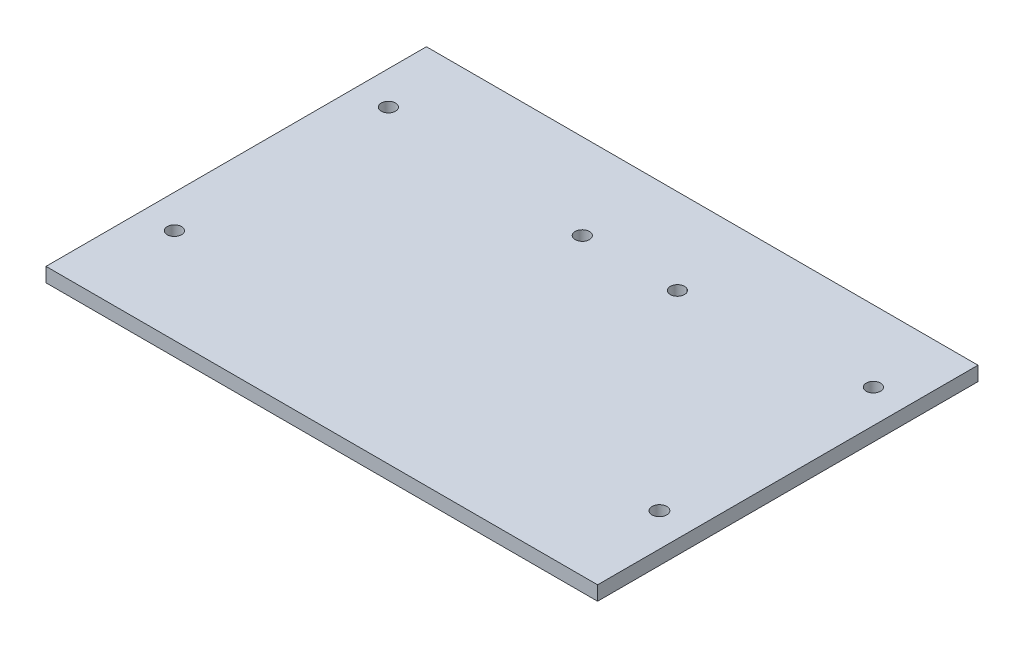
ISO-10303-21;
HEADER;
FILE_DESCRIPTION(('STEP AP214'),'2;1');
FILE_NAME('part.step','',(''),(''),'','','');
FILE_SCHEMA(('AUTOMOTIVE_DESIGN { 1 0 10303 214 1 1 1 1 }'));
ENDSEC;
DATA;
#1=APPLICATION_CONTEXT('core data for automotive mechanical design processes');
#2=APPLICATION_PROTOCOL_DEFINITION('international standard','automotive_design',2000,#1);
#3=PRODUCT_CONTEXT('',#1,'mechanical');
#4=PRODUCT('Part','Part','',(#3));
#5=PRODUCT_RELATED_PRODUCT_CATEGORY('part','',(#4));
#6=PRODUCT_DEFINITION_FORMATION('','',#4);
#7=PRODUCT_DEFINITION_CONTEXT('part definition',#1,'design');
#8=PRODUCT_DEFINITION('design','',#6,#7);
#9=PRODUCT_DEFINITION_SHAPE('','',#8);
#10=(LENGTH_UNIT() NAMED_UNIT(*) SI_UNIT(.MILLI.,.METRE.));
#11=(NAMED_UNIT(*) PLANE_ANGLE_UNIT() SI_UNIT($,.RADIAN.));
#12=(NAMED_UNIT(*) SI_UNIT($,.STERADIAN.) SOLID_ANGLE_UNIT());
#13=UNCERTAINTY_MEASURE_WITH_UNIT(LENGTH_MEASURE(1.E-05),#10,'distance_accuracy_value','');
#14=(GEOMETRIC_REPRESENTATION_CONTEXT(3) GLOBAL_UNCERTAINTY_ASSIGNED_CONTEXT((#13)) GLOBAL_UNIT_ASSIGNED_CONTEXT((#10,
#11,#12)) REPRESENTATION_CONTEXT('',''));
#15=CARTESIAN_POINT('',(0.,0.,0.));
#16=DIRECTION('',(0.,0.,1.));
#17=DIRECTION('',(1.,0.,0.));
#18=AXIS2_PLACEMENT_3D('',#15,#16,#17);
#19=CARTESIAN_POINT('',(-58.,3.,40.));
#20=DIRECTION('',(1.,0.,0.));
#21=DIRECTION('',(0.,0.,-1.));
#22=AXIS2_PLACEMENT_3D('',#19,#20,#21);
#23=PLANE('',#22);
#24=DIRECTION('',(0.,0.,1.));
#25=VECTOR('',#24,1.);
#26=CARTESIAN_POINT('',(-58.,0.,40.));
#27=LINE('',#26,#25);
#28=CARTESIAN_POINT('',(-58.,0.,-40.));
#29=VERTEX_POINT('',#28);
#30=CARTESIAN_POINT('',(-58.,0.,40.));
#31=VERTEX_POINT('',#30);
#32=EDGE_CURVE('E102',#29,#31,#27,.T.);
#33=ORIENTED_EDGE('',*,*,#32,.T.);
#34=DIRECTION('',(0.,-1.,0.));
#35=VECTOR('',#34,1.);
#36=CARTESIAN_POINT('',(-58.,3.,40.));
#37=LINE('',#36,#35);
#38=CARTESIAN_POINT('',(-58.,3.,40.));
#39=VERTEX_POINT('',#38);
#40=EDGE_CURVE('E11',#39,#31,#37,.T.);
#41=ORIENTED_EDGE('',*,*,#40,.F.);
#42=DIRECTION('',(0.,0.,1.));
#43=VECTOR('',#42,1.);
#44=CARTESIAN_POINT('',(-58.,3.,40.));
#45=LINE('',#44,#43);
#46=CARTESIAN_POINT('',(-58.,3.,-40.));
#47=VERTEX_POINT('',#46);
#48=EDGE_CURVE('E90',#47,#39,#45,.T.);
#49=ORIENTED_EDGE('',*,*,#48,.F.);
#50=DIRECTION('',(0.,-1.,0.));
#51=VECTOR('',#50,1.);
#52=CARTESIAN_POINT('',(-58.,3.,-40.));
#53=LINE('',#52,#51);
#54=EDGE_CURVE('E98',#47,#29,#53,.T.);
#55=ORIENTED_EDGE('',*,*,#54,.T.);
#56=EDGE_LOOP('',(#33,#41,#49,#55));
#57=FACE_BOUND('',#56,.T.);
#58=ADVANCED_FACE('F39',(#57),#23,.F.);
#59=CARTESIAN_POINT('',(58.,3.,40.));
#60=DIRECTION('',(0.,0.,-1.));
#61=DIRECTION('',(-1.,0.,0.));
#62=AXIS2_PLACEMENT_3D('',#59,#60,#61);
#63=PLANE('',#62);
#64=DIRECTION('',(1.,0.,0.));
#65=VECTOR('',#64,1.);
#66=CARTESIAN_POINT('',(58.,0.,40.));
#67=LINE('',#66,#65);
#68=CARTESIAN_POINT('',(58.,0.,40.));
#69=VERTEX_POINT('',#68);
#70=EDGE_CURVE('E94',#31,#69,#67,.T.);
#71=ORIENTED_EDGE('',*,*,#70,.T.);
#72=DIRECTION('',(0.,-1.,0.));
#73=VECTOR('',#72,1.);
#74=CARTESIAN_POINT('',(58.,3.,40.));
#75=LINE('',#74,#73);
#76=CARTESIAN_POINT('',(58.,3.,40.));
#77=VERTEX_POINT('',#76);
#78=EDGE_CURVE('E47',#77,#69,#75,.T.);
#79=ORIENTED_EDGE('',*,*,#78,.F.);
#80=DIRECTION('',(1.,0.,0.));
#81=VECTOR('',#80,1.);
#82=CARTESIAN_POINT('',(58.,3.,40.));
#83=LINE('',#82,#81);
#84=EDGE_CURVE('E85',#39,#77,#83,.T.);
#85=ORIENTED_EDGE('',*,*,#84,.F.);
#86=ORIENTED_EDGE('',*,*,#40,.T.);
#87=EDGE_LOOP('',(#71,#79,#85,#86));
#88=FACE_BOUND('',#87,.T.);
#89=ADVANCED_FACE('F93',(#88),#63,.F.);
#90=CARTESIAN_POINT('',(58.,3.,40.));
#91=DIRECTION('',(-1.,0.,0.));
#92=DIRECTION('',(0.,0.,1.));
#93=AXIS2_PLACEMENT_3D('',#90,#91,#92);
#94=PLANE('',#93);
#95=DIRECTION('',(0.,0.,-1.));
#96=VECTOR('',#95,1.);
#97=CARTESIAN_POINT('',(58.,0.,40.));
#98=LINE('',#97,#96);
#99=CARTESIAN_POINT('',(58.,0.,-40.));
#100=VERTEX_POINT('',#99);
#101=EDGE_CURVE('E72',#69,#100,#98,.T.);
#102=ORIENTED_EDGE('',*,*,#101,.T.);
#103=DIRECTION('',(0.,-1.,0.));
#104=VECTOR('',#103,1.);
#105=CARTESIAN_POINT('',(58.,3.,-40.));
#106=LINE('',#105,#104);
#107=CARTESIAN_POINT('',(58.,3.,-40.));
#108=VERTEX_POINT('',#107);
#109=EDGE_CURVE('E95',#108,#100,#106,.T.);
#110=ORIENTED_EDGE('',*,*,#109,.F.);
#111=DIRECTION('',(0.,0.,-1.));
#112=VECTOR('',#111,1.);
#113=CARTESIAN_POINT('',(58.,3.,40.));
#114=LINE('',#113,#112);
#115=EDGE_CURVE('E88',#77,#108,#114,.T.);
#116=ORIENTED_EDGE('',*,*,#115,.F.);
#117=ORIENTED_EDGE('',*,*,#78,.T.);
#118=EDGE_LOOP('',(#102,#110,#116,#117));
#119=FACE_BOUND('',#118,.T.);
#120=ADVANCED_FACE('F96',(#119),#94,.F.);
#121=CARTESIAN_POINT('',(58.,3.,-40.));
#122=DIRECTION('',(0.,0.,1.));
#123=DIRECTION('',(1.,0.,0.));
#124=AXIS2_PLACEMENT_3D('',#121,#122,#123);
#125=PLANE('',#124);
#126=DIRECTION('',(-1.,0.,0.));
#127=VECTOR('',#126,1.);
#128=CARTESIAN_POINT('',(58.,0.,-40.));
#129=LINE('',#128,#127);
#130=EDGE_CURVE('E78',#100,#29,#129,.T.);
#131=ORIENTED_EDGE('',*,*,#130,.T.);
#132=ORIENTED_EDGE('',*,*,#54,.F.);
#133=DIRECTION('',(-1.,0.,0.));
#134=VECTOR('',#133,1.);
#135=CARTESIAN_POINT('',(58.,3.,-40.));
#136=LINE('',#135,#134);
#137=EDGE_CURVE('E55',#108,#47,#136,.T.);
#138=ORIENTED_EDGE('',*,*,#137,.F.);
#139=ORIENTED_EDGE('',*,*,#109,.T.);
#140=EDGE_LOOP('',(#131,#132,#138,#139));
#141=FACE_BOUND('',#140,.T.);
#142=ADVANCED_FACE('F110',(#141),#125,.F.);
#143=CARTESIAN_POINT('',(0.,3.,0.));
#144=DIRECTION('',(0.,1.,0.));
#145=DIRECTION('',(0.,0.,1.));
#146=AXIS2_PLACEMENT_3D('',#143,#144,#145);
#147=PLANE('',#146);
#148=CARTESIAN_POINT('',(-7.21596902848531,3.,-22.0000000000001));
#149=DIRECTION('',(0.,1.,0.));
#150=DIRECTION('',(0.,0.,1.));
#151=AXIS2_PLACEMENT_3D('',#148,#149,#150);
#152=CIRCLE('',#151,1.5);
#153=CARTESIAN_POINT('',(-7.21596902848531,3.,-20.5000000000001));
#154=VERTEX_POINT('',#153);
#155=EDGE_CURVE('E146',#154,#154,#152,.T.);
#156=ORIENTED_EDGE('',*,*,#155,.F.);
#157=EDGE_LOOP('',(#156));
#158=FACE_BOUND('',#157,.T.);
#159=CARTESIAN_POINT('',(12.7840309715147,3.,-22.0000000000001));
#160=DIRECTION('',(0.,1.,0.));
#161=DIRECTION('',(0.,0.,1.));
#162=AXIS2_PLACEMENT_3D('',#159,#160,#161);
#163=CIRCLE('',#162,1.5);
#164=CARTESIAN_POINT('',(12.7840309715147,3.,-20.5000000000001));
#165=VERTEX_POINT('',#164);
#166=EDGE_CURVE('E143',#165,#165,#163,.T.);
#167=ORIENTED_EDGE('',*,*,#166,.F.);
#168=EDGE_LOOP('',(#167));
#169=FACE_BOUND('',#168,.T.);
#170=CARTESIAN_POINT('',(-51.,3.,-25.));
#171=DIRECTION('',(0.,1.,0.));
#172=DIRECTION('',(0.,0.,1.));
#173=AXIS2_PLACEMENT_3D('',#170,#171,#172);
#174=CIRCLE('',#173,1.5);
#175=CARTESIAN_POINT('',(-51.,3.,-23.5));
#176=VERTEX_POINT('',#175);
#177=EDGE_CURVE('E105',#176,#176,#174,.T.);
#178=ORIENTED_EDGE('',*,*,#177,.F.);
#179=EDGE_LOOP('',(#178));
#180=FACE_BOUND('',#179,.T.);
#181=CARTESIAN_POINT('',(51.,3.,-25.));
#182=DIRECTION('',(0.,1.,0.));
#183=DIRECTION('',(0.,0.,1.));
#184=AXIS2_PLACEMENT_3D('',#181,#182,#183);
#185=CIRCLE('',#184,1.5);
#186=CARTESIAN_POINT('',(51.,3.,-23.5));
#187=VERTEX_POINT('',#186);
#188=EDGE_CURVE('E118',#187,#187,#185,.T.);
#189=ORIENTED_EDGE('',*,*,#188,.F.);
#190=EDGE_LOOP('',(#189));
#191=FACE_BOUND('',#190,.T.);
#192=CARTESIAN_POINT('',(51.,3.,20.));
#193=DIRECTION('',(0.,1.,0.));
#194=DIRECTION('',(0.,0.,1.));
#195=AXIS2_PLACEMENT_3D('',#192,#193,#194);
#196=CIRCLE('',#195,1.54999999999999);
#197=CARTESIAN_POINT('',(51.,3.,21.55));
#198=VERTEX_POINT('',#197);
#199=EDGE_CURVE('E121',#198,#198,#196,.T.);
#200=ORIENTED_EDGE('',*,*,#199,.F.);
#201=EDGE_LOOP('',(#200));
#202=FACE_BOUND('',#201,.T.);
#203=CARTESIAN_POINT('',(-51.,3.,20.));
#204=DIRECTION('',(0.,1.,0.));
#205=DIRECTION('',(0.,0.,1.));
#206=AXIS2_PLACEMENT_3D('',#203,#204,#205);
#207=CIRCLE('',#206,1.5);
#208=CARTESIAN_POINT('',(-51.,3.,21.5));
#209=VERTEX_POINT('',#208);
#210=EDGE_CURVE('E124',#209,#209,#207,.T.);
#211=ORIENTED_EDGE('',*,*,#210,.F.);
#212=EDGE_LOOP('',(#211));
#213=FACE_BOUND('',#212,.T.);
#214=ORIENTED_EDGE('',*,*,#48,.T.);
#215=ORIENTED_EDGE('',*,*,#84,.T.);
#216=ORIENTED_EDGE('',*,*,#115,.T.);
#217=ORIENTED_EDGE('',*,*,#137,.T.);
#218=EDGE_LOOP('',(#214,#215,#216,#217));
#219=FACE_BOUND('',#218,.T.);
#220=ADVANCED_FACE('F86',(#158,#169,#180,#191,#202,#213,#219),#147,.T.);
#221=CARTESIAN_POINT('',(0.,0.,0.));
#222=DIRECTION('',(0.,1.,0.));
#223=DIRECTION('',(0.,0.,1.));
#224=AXIS2_PLACEMENT_3D('',#221,#222,#223);
#225=PLANE('',#224);
#226=CARTESIAN_POINT('',(-7.21596902848531,0.,-22.0000000000001));
#227=DIRECTION('',(0.,1.,0.));
#228=DIRECTION('',(0.,0.,1.));
#229=AXIS2_PLACEMENT_3D('',#226,#227,#228);
#230=CIRCLE('',#229,1.5);
#231=CARTESIAN_POINT('',(-7.21596902848531,0.,-20.5000000000001));
#232=VERTEX_POINT('',#231);
#233=EDGE_CURVE('E135',#232,#232,#230,.T.);
#234=ORIENTED_EDGE('',*,*,#233,.T.);
#235=EDGE_LOOP('',(#234));
#236=FACE_BOUND('',#235,.T.);
#237=CARTESIAN_POINT('',(12.7840309715147,0.,-22.0000000000001));
#238=DIRECTION('',(0.,1.,0.));
#239=DIRECTION('',(0.,0.,1.));
#240=AXIS2_PLACEMENT_3D('',#237,#238,#239);
#241=CIRCLE('',#240,1.5);
#242=CARTESIAN_POINT('',(12.7840309715147,0.,-20.5000000000001));
#243=VERTEX_POINT('',#242);
#244=EDGE_CURVE('E140',#243,#243,#241,.T.);
#245=ORIENTED_EDGE('',*,*,#244,.T.);
#246=EDGE_LOOP('',(#245));
#247=FACE_BOUND('',#246,.T.);
#248=CARTESIAN_POINT('',(-51.,0.,-25.));
#249=DIRECTION('',(0.,-1.,0.));
#250=DIRECTION('',(0.,0.,-1.));
#251=AXIS2_PLACEMENT_3D('',#248,#249,#250);
#252=CIRCLE('',#251,1.5);
#253=CARTESIAN_POINT('',(-51.,0.,-26.5));
#254=VERTEX_POINT('',#253);
#255=EDGE_CURVE('E131',#254,#254,#252,.T.);
#256=ORIENTED_EDGE('',*,*,#255,.F.);
#257=EDGE_LOOP('',(#256));
#258=FACE_BOUND('',#257,.T.);
#259=CARTESIAN_POINT('',(51.,0.,-25.));
#260=DIRECTION('',(0.,-1.,0.));
#261=DIRECTION('',(0.,0.,-1.));
#262=AXIS2_PLACEMENT_3D('',#259,#260,#261);
#263=CIRCLE('',#262,1.5);
#264=CARTESIAN_POINT('',(51.,0.,-26.5));
#265=VERTEX_POINT('',#264);
#266=EDGE_CURVE('E134',#265,#265,#263,.T.);
#267=ORIENTED_EDGE('',*,*,#266,.F.);
#268=EDGE_LOOP('',(#267));
#269=FACE_BOUND('',#268,.T.);
#270=CARTESIAN_POINT('',(51.,0.,20.));
#271=DIRECTION('',(0.,-1.,0.));
#272=DIRECTION('',(0.,0.,-1.));
#273=AXIS2_PLACEMENT_3D('',#270,#271,#272);
#274=CIRCLE('',#273,1.54999999999999);
#275=CARTESIAN_POINT('',(51.,0.,18.45));
#276=VERTEX_POINT('',#275);
#277=EDGE_CURVE('E130',#276,#276,#274,.T.);
#278=ORIENTED_EDGE('',*,*,#277,.F.);
#279=EDGE_LOOP('',(#278));
#280=FACE_BOUND('',#279,.T.);
#281=CARTESIAN_POINT('',(-51.,0.,20.));
#282=DIRECTION('',(0.,-1.,0.));
#283=DIRECTION('',(0.,0.,-1.));
#284=AXIS2_PLACEMENT_3D('',#281,#282,#283);
#285=CIRCLE('',#284,1.5);
#286=CARTESIAN_POINT('',(-51.,0.,18.5));
#287=VERTEX_POINT('',#286);
#288=EDGE_CURVE('E127',#287,#287,#285,.T.);
#289=ORIENTED_EDGE('',*,*,#288,.F.);
#290=EDGE_LOOP('',(#289));
#291=FACE_BOUND('',#290,.T.);
#292=ORIENTED_EDGE('',*,*,#32,.F.);
#293=ORIENTED_EDGE('',*,*,#130,.F.);
#294=ORIENTED_EDGE('',*,*,#101,.F.);
#295=ORIENTED_EDGE('',*,*,#70,.F.);
#296=EDGE_LOOP('',(#292,#293,#294,#295));
#297=FACE_BOUND('',#296,.T.);
#298=ADVANCED_FACE('F113',(#236,#247,#258,#269,#280,#291,#297),#225,.F.);
#299=CARTESIAN_POINT('',(-51.,10.,20.));
#300=DIRECTION('',(0.,-1.,0.));
#301=DIRECTION('',(0.,0.,-1.));
#302=AXIS2_PLACEMENT_3D('',#299,#300,#301);
#303=CYLINDRICAL_SURFACE('',#302,1.5);
#304=ORIENTED_EDGE('',*,*,#210,.T.);
#305=EDGE_LOOP('',(#304));
#306=FACE_BOUND('',#305,.T.);
#307=ORIENTED_EDGE('',*,*,#288,.T.);
#308=EDGE_LOOP('',(#307));
#309=FACE_BOUND('',#308,.T.);
#310=ADVANCED_FACE('F174',(#306,#309),#303,.F.);
#311=CARTESIAN_POINT('',(51.,10.,20.));
#312=DIRECTION('',(0.,-1.,0.));
#313=DIRECTION('',(0.,0.,-1.));
#314=AXIS2_PLACEMENT_3D('',#311,#312,#313);
#315=CYLINDRICAL_SURFACE('',#314,1.54999999999999);
#316=ORIENTED_EDGE('',*,*,#199,.T.);
#317=EDGE_LOOP('',(#316));
#318=FACE_BOUND('',#317,.T.);
#319=ORIENTED_EDGE('',*,*,#277,.T.);
#320=EDGE_LOOP('',(#319));
#321=FACE_BOUND('',#320,.T.);
#322=ADVANCED_FACE('F177',(#318,#321),#315,.F.);
#323=CARTESIAN_POINT('',(51.,10.,-25.));
#324=DIRECTION('',(0.,-1.,0.));
#325=DIRECTION('',(0.,0.,-1.));
#326=AXIS2_PLACEMENT_3D('',#323,#324,#325);
#327=CYLINDRICAL_SURFACE('',#326,1.5);
#328=ORIENTED_EDGE('',*,*,#188,.T.);
#329=EDGE_LOOP('',(#328));
#330=FACE_BOUND('',#329,.T.);
#331=ORIENTED_EDGE('',*,*,#266,.T.);
#332=EDGE_LOOP('',(#331));
#333=FACE_BOUND('',#332,.T.);
#334=ADVANCED_FACE('F243',(#330,#333),#327,.F.);
#335=CARTESIAN_POINT('',(-51.,10.,-25.));
#336=DIRECTION('',(0.,-1.,0.));
#337=DIRECTION('',(0.,0.,-1.));
#338=AXIS2_PLACEMENT_3D('',#335,#336,#337);
#339=CYLINDRICAL_SURFACE('',#338,1.5);
#340=ORIENTED_EDGE('',*,*,#177,.T.);
#341=EDGE_LOOP('',(#340));
#342=FACE_BOUND('',#341,.T.);
#343=ORIENTED_EDGE('',*,*,#255,.T.);
#344=EDGE_LOOP('',(#343));
#345=FACE_BOUND('',#344,.T.);
#346=ADVANCED_FACE('F211',(#342,#345),#339,.F.);
#347=CARTESIAN_POINT('',(12.7840309715147,0.,-22.0000000000001));
#348=DIRECTION('',(0.,1.,0.));
#349=DIRECTION('',(0.,0.,1.));
#350=AXIS2_PLACEMENT_3D('',#347,#348,#349);
#351=CYLINDRICAL_SURFACE('',#350,1.5);
#352=ORIENTED_EDGE('',*,*,#244,.F.);
#353=EDGE_LOOP('',(#352));
#354=FACE_BOUND('',#353,.T.);
#355=ORIENTED_EDGE('',*,*,#166,.T.);
#356=EDGE_LOOP('',(#355));
#357=FACE_BOUND('',#356,.T.);
#358=ADVANCED_FACE('F157',(#354,#357),#351,.F.);
#359=CARTESIAN_POINT('',(-7.21596902848531,0.,-22.0000000000001));
#360=DIRECTION('',(0.,1.,0.));
#361=DIRECTION('',(0.,0.,1.));
#362=AXIS2_PLACEMENT_3D('',#359,#360,#361);
#363=CYLINDRICAL_SURFACE('',#362,1.5);
#364=ORIENTED_EDGE('',*,*,#233,.F.);
#365=EDGE_LOOP('',(#364));
#366=FACE_BOUND('',#365,.T.);
#367=ORIENTED_EDGE('',*,*,#155,.T.);
#368=EDGE_LOOP('',(#367));
#369=FACE_BOUND('',#368,.T.);
#370=ADVANCED_FACE('F154',(#366,#369),#363,.F.);
#371=CLOSED_SHELL('',(#58,#89,#120,#142,#220,#298,#310,#322,#334,#346,#358,#370));
#372=MANIFOLD_SOLID_BREP('B2',#371);
#373=ADVANCED_BREP_SHAPE_REPRESENTATION('',(#18,#372),#14);
#374=SHAPE_DEFINITION_REPRESENTATION(#9,#373);
ENDSEC;
END-ISO-10303-21;
